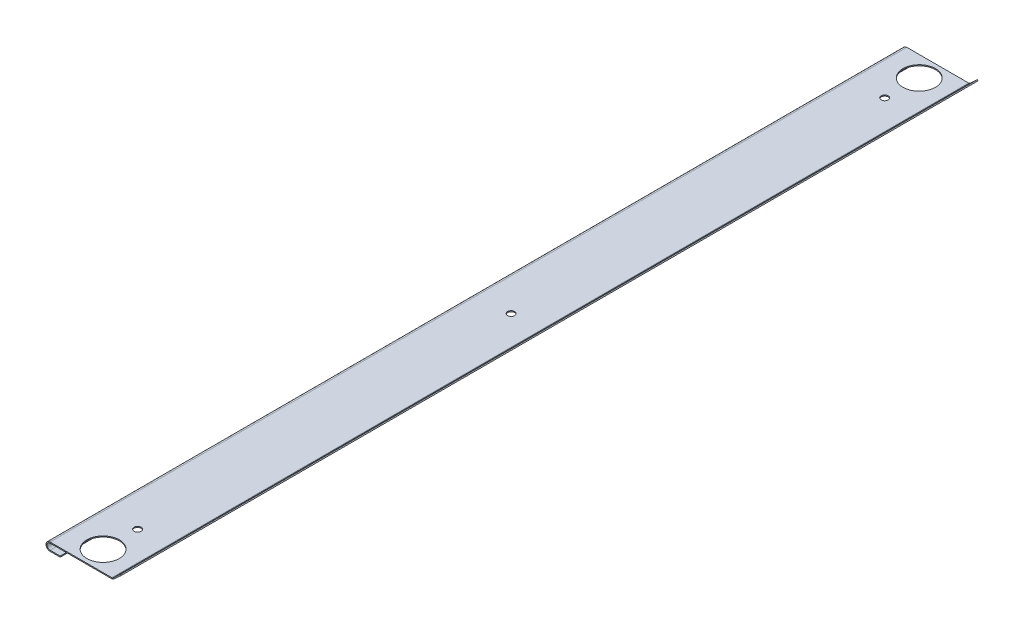
ISO-10303-21;
HEADER;
FILE_DESCRIPTION(('STEP AP214'),'2;1');
FILE_NAME('part.step','',(''),(''),'','','');
FILE_SCHEMA(('AUTOMOTIVE_DESIGN { 1 0 10303 214 1 1 1 1 }'));
ENDSEC;
DATA;
#1=APPLICATION_CONTEXT('core data for automotive mechanical design processes');
#2=APPLICATION_PROTOCOL_DEFINITION('international standard','automotive_design',2000,#1);
#3=PRODUCT_CONTEXT('',#1,'mechanical');
#4=PRODUCT('Part','Part','',(#3));
#5=PRODUCT_RELATED_PRODUCT_CATEGORY('part','',(#4));
#6=PRODUCT_DEFINITION_FORMATION('','',#4);
#7=PRODUCT_DEFINITION_CONTEXT('part definition',#1,'design');
#8=PRODUCT_DEFINITION('design','',#6,#7);
#9=PRODUCT_DEFINITION_SHAPE('','',#8);
#10=(LENGTH_UNIT() NAMED_UNIT(*) SI_UNIT(.MILLI.,.METRE.));
#11=(NAMED_UNIT(*) PLANE_ANGLE_UNIT() SI_UNIT($,.RADIAN.));
#12=(NAMED_UNIT(*) SI_UNIT($,.STERADIAN.) SOLID_ANGLE_UNIT());
#13=UNCERTAINTY_MEASURE_WITH_UNIT(LENGTH_MEASURE(1.E-05),#10,'distance_accuracy_value','');
#14=(GEOMETRIC_REPRESENTATION_CONTEXT(3) GLOBAL_UNCERTAINTY_ASSIGNED_CONTEXT((#13)) GLOBAL_UNIT_ASSIGNED_CONTEXT((#10,
#11,#12)) REPRESENTATION_CONTEXT('',''));
#15=CARTESIAN_POINT('',(0.,0.,0.));
#16=DIRECTION('',(0.,0.,1.));
#17=DIRECTION('',(1.,0.,0.));
#18=AXIS2_PLACEMENT_3D('',#15,#16,#17);
#19=CARTESIAN_POINT('',(0.,0.5,211.));
#20=DIRECTION('',(0.,1.,0.));
#21=DIRECTION('',(-1.,0.,0.));
#22=AXIS2_PLACEMENT_3D('',#19,#20,#21);
#23=PLANE('',#22);
#24=CARTESIAN_POINT('',(-14.8833180977794,0.499999999999998,184.));
#25=DIRECTION('',(0.,1.,0.));
#26=DIRECTION('',(1.,0.,0.));
#27=AXIS2_PLACEMENT_3D('',#24,#25,#26);
#28=CIRCLE('',#27,1.74999999999999);
#29=CARTESIAN_POINT('',(-13.1333180977794,0.499999999999998,184.));
#30=VERTEX_POINT('',#29);
#31=EDGE_CURVE('E607',#30,#30,#28,.T.);
#32=ORIENTED_EDGE('',*,*,#31,.F.);
#33=EDGE_LOOP('',(#32));
#34=FACE_BOUND('',#33,.T.);
#35=CARTESIAN_POINT('',(-14.8833180977795,0.499999999999998,-184.));
#36=DIRECTION('',(0.,1.,0.));
#37=DIRECTION('',(-1.,0.,0.));
#38=AXIS2_PLACEMENT_3D('',#35,#36,#37);
#39=CIRCLE('',#38,1.74999999999999);
#40=CARTESIAN_POINT('',(-16.6333180977795,0.499999999999998,-184.));
#41=VERTEX_POINT('',#40);
#42=EDGE_CURVE('E601',#41,#41,#39,.T.);
#43=ORIENTED_EDGE('',*,*,#42,.F.);
#44=EDGE_LOOP('',(#43));
#45=FACE_BOUND('',#44,.T.);
#46=CARTESIAN_POINT('',(-14.8833180977795,0.499999999999998,0.));
#47=DIRECTION('',(0.,1.,0.));
#48=DIRECTION('',(-1.,0.,0.));
#49=AXIS2_PLACEMENT_3D('',#46,#47,#48);
#50=CIRCLE('',#49,1.75);
#51=CARTESIAN_POINT('',(-16.6333180977795,0.499999999999998,0.));
#52=VERTEX_POINT('',#51);
#53=EDGE_CURVE('E595',#52,#52,#50,.T.);
#54=ORIENTED_EDGE('',*,*,#53,.F.);
#55=EDGE_LOOP('',(#54));
#56=FACE_BOUND('',#55,.T.);
#57=CARTESIAN_POINT('',(-14.8833180977795,0.499999999999998,-201.));
#58=DIRECTION('',(0.,1.,0.));
#59=DIRECTION('',(-1.,0.,0.));
#60=AXIS2_PLACEMENT_3D('',#57,#58,#59);
#61=CIRCLE('',#60,8.00000000000002);
#62=CARTESIAN_POINT('',(-22.8833180977795,0.499999999999997,-201.));
#63=VERTEX_POINT('',#62);
#64=EDGE_CURVE('E180',#63,#63,#61,.F.);
#65=ORIENTED_EDGE('',*,*,#64,.T.);
#66=EDGE_LOOP('',(#65));
#67=FACE_BOUND('',#66,.T.);
#68=DIRECTION('',(1.,0.,0.));
#69=VECTOR('',#68,1.);
#70=CARTESIAN_POINT('',(0.,0.5,-211.));
#71=LINE('',#70,#69);
#72=CARTESIAN_POINT('',(-31.,0.499999999999996,-211.));
#73=VERTEX_POINT('',#72);
#74=CARTESIAN_POINT('',(-0.58331809777948,0.5,-211.));
#75=VERTEX_POINT('',#74);
#76=EDGE_CURVE('E188',#73,#75,#71,.T.);
#77=ORIENTED_EDGE('',*,*,#76,.F.);
#78=DIRECTION('',(0.,0.,-1.));
#79=VECTOR('',#78,1.);
#80=CARTESIAN_POINT('',(-31.,0.499999999999996,211.));
#81=LINE('',#80,#79);
#82=CARTESIAN_POINT('',(-31.,0.499999999999996,211.));
#83=VERTEX_POINT('',#82);
#84=EDGE_CURVE('E218',#83,#73,#81,.T.);
#85=ORIENTED_EDGE('',*,*,#84,.F.);
#86=DIRECTION('',(1.,0.,0.));
#87=VECTOR('',#86,1.);
#88=CARTESIAN_POINT('',(0.,0.5,211.));
#89=LINE('',#88,#87);
#90=CARTESIAN_POINT('',(-0.58331809777948,0.5,211.));
#91=VERTEX_POINT('',#90);
#92=EDGE_CURVE('E142',#83,#91,#89,.T.);
#93=ORIENTED_EDGE('',*,*,#92,.T.);
#94=DIRECTION('',(0.,0.,-1.));
#95=VECTOR('',#94,1.);
#96=CARTESIAN_POINT('',(-0.58331809777948,0.5,211.));
#97=LINE('',#96,#95);
#98=EDGE_CURVE('E221',#91,#75,#97,.T.);
#99=ORIENTED_EDGE('',*,*,#98,.T.);
#100=EDGE_LOOP('',(#77,#85,#93,#99));
#101=FACE_BOUND('',#100,.T.);
#102=CARTESIAN_POINT('',(-14.8833180977794,0.499999999999998,201.));
#103=DIRECTION('',(0.,1.,0.));
#104=DIRECTION('',(-1.,0.,0.));
#105=AXIS2_PLACEMENT_3D('',#102,#103,#104);
#106=CIRCLE('',#105,8.00000000000002);
#107=CARTESIAN_POINT('',(-22.8833180977795,0.499999999999997,201.));
#108=VERTEX_POINT('',#107);
#109=EDGE_CURVE('E588',#108,#108,#106,.F.);
#110=ORIENTED_EDGE('',*,*,#109,.T.);
#111=EDGE_LOOP('',(#110));
#112=FACE_BOUND('',#111,.T.);
#113=ADVANCED_FACE('F38',(#34,#45,#56,#67,#101,#112),#23,.T.);
#114=CARTESIAN_POINT('',(0.,0.,211.));
#115=DIRECTION('',(0.,1.,0.));
#116=DIRECTION('',(-1.,0.,0.));
#117=AXIS2_PLACEMENT_3D('',#114,#115,#116);
#118=PLANE('',#117);
#119=CARTESIAN_POINT('',(-14.8833180977794,0.,184.));
#120=DIRECTION('',(0.,1.,0.));
#121=DIRECTION('',(1.,0.,0.));
#122=AXIS2_PLACEMENT_3D('',#119,#120,#121);
#123=CIRCLE('',#122,1.74999999999999);
#124=CARTESIAN_POINT('',(-13.1333180977794,0.,184.));
#125=VERTEX_POINT('',#124);
#126=EDGE_CURVE('E604',#125,#125,#123,.T.);
#127=ORIENTED_EDGE('',*,*,#126,.T.);
#128=EDGE_LOOP('',(#127));
#129=FACE_BOUND('',#128,.T.);
#130=CARTESIAN_POINT('',(-14.8833180977795,0.,-184.));
#131=DIRECTION('',(0.,1.,0.));
#132=DIRECTION('',(-1.,0.,0.));
#133=AXIS2_PLACEMENT_3D('',#130,#131,#132);
#134=CIRCLE('',#133,1.74999999999999);
#135=CARTESIAN_POINT('',(-16.6333180977795,0.,-184.));
#136=VERTEX_POINT('',#135);
#137=EDGE_CURVE('E598',#136,#136,#134,.T.);
#138=ORIENTED_EDGE('',*,*,#137,.T.);
#139=EDGE_LOOP('',(#138));
#140=FACE_BOUND('',#139,.T.);
#141=CARTESIAN_POINT('',(-14.8833180977795,0.,0.));
#142=DIRECTION('',(0.,1.,0.));
#143=DIRECTION('',(-1.,0.,0.));
#144=AXIS2_PLACEMENT_3D('',#141,#142,#143);
#145=CIRCLE('',#144,1.75);
#146=CARTESIAN_POINT('',(-16.6333180977795,0.,0.));
#147=VERTEX_POINT('',#146);
#148=EDGE_CURVE('E594',#147,#147,#145,.T.);
#149=ORIENTED_EDGE('',*,*,#148,.T.);
#150=EDGE_LOOP('',(#149));
#151=FACE_BOUND('',#150,.T.);
#152=DIRECTION('',(1.,0.,0.));
#153=VECTOR('',#152,1.);
#154=CARTESIAN_POINT('',(0.,0.,-211.));
#155=LINE('',#154,#153);
#156=CARTESIAN_POINT('',(-31.,0.,-211.));
#157=VERTEX_POINT('',#156);
#158=CARTESIAN_POINT('',(-0.58331809777948,0.,-211.));
#159=VERTEX_POINT('',#158);
#160=EDGE_CURVE('E203',#157,#159,#155,.T.);
#161=ORIENTED_EDGE('',*,*,#160,.T.);
#162=DIRECTION('',(0.,0.,-1.));
#163=VECTOR('',#162,1.);
#164=CARTESIAN_POINT('',(-0.58331809777948,0.,211.));
#165=LINE('',#164,#163);
#166=CARTESIAN_POINT('',(-0.58331809777948,0.,211.));
#167=VERTEX_POINT('',#166);
#168=EDGE_CURVE('E164',#167,#159,#165,.T.);
#169=ORIENTED_EDGE('',*,*,#168,.F.);
#170=DIRECTION('',(1.,0.,0.));
#171=VECTOR('',#170,1.);
#172=CARTESIAN_POINT('',(0.,0.,211.));
#173=LINE('',#172,#171);
#174=CARTESIAN_POINT('',(-31.,0.,211.));
#175=VERTEX_POINT('',#174);
#176=EDGE_CURVE('E139',#175,#167,#173,.T.);
#177=ORIENTED_EDGE('',*,*,#176,.F.);
#178=DIRECTION('',(0.,0.,-1.));
#179=VECTOR('',#178,1.);
#180=CARTESIAN_POINT('',(-31.,0.,211.));
#181=LINE('',#180,#179);
#182=EDGE_CURVE('E158',#175,#157,#181,.T.);
#183=ORIENTED_EDGE('',*,*,#182,.T.);
#184=EDGE_LOOP('',(#161,#169,#177,#183));
#185=FACE_BOUND('',#184,.T.);
#186=CARTESIAN_POINT('',(-14.8833180977795,0.,-201.));
#187=DIRECTION('',(0.,1.,0.));
#188=DIRECTION('',(0.,0.,1.));
#189=AXIS2_PLACEMENT_3D('',#186,#187,#188);
#190=CIRCLE('',#189,8.00000000000002);
#191=CARTESIAN_POINT('',(-14.8833180977795,0.,-193.));
#192=VERTEX_POINT('',#191);
#193=EDGE_CURVE('E585',#192,#192,#190,.T.);
#194=ORIENTED_EDGE('',*,*,#193,.T.);
#195=EDGE_LOOP('',(#194));
#196=FACE_BOUND('',#195,.T.);
#197=CARTESIAN_POINT('',(-14.8833180977794,0.,201.));
#198=DIRECTION('',(0.,1.,0.));
#199=DIRECTION('',(0.,0.,-1.));
#200=AXIS2_PLACEMENT_3D('',#197,#198,#199);
#201=CIRCLE('',#200,8.00000000000002);
#202=CARTESIAN_POINT('',(-14.8833180977794,0.,193.));
#203=VERTEX_POINT('',#202);
#204=EDGE_CURVE('E591',#203,#203,#201,.T.);
#205=ORIENTED_EDGE('',*,*,#204,.T.);
#206=EDGE_LOOP('',(#205));
#207=FACE_BOUND('',#206,.T.);
#208=ADVANCED_FACE('F166',(#129,#140,#151,#185,#196,#207),#118,.F.);
#209=CARTESIAN_POINT('',(-31.,-3.,211.));
#210=DIRECTION('',(0.,0.,1.));
#211=DIRECTION('',(1.,0.,0.));
#212=AXIS2_PLACEMENT_3D('',#209,#210,#211);
#213=PLANE('',#212);
#214=DIRECTION('',(0.,-1.,0.));
#215=VECTOR('',#214,1.);
#216=CARTESIAN_POINT('',(-31.,-3.,211.));
#217=LINE('',#216,#215);
#218=CARTESIAN_POINT('',(-31.,-3.,211.));
#219=VERTEX_POINT('',#218);
#220=CARTESIAN_POINT('',(-31.,-3.5,211.));
#221=VERTEX_POINT('',#220);
#222=EDGE_CURVE('E11',#219,#221,#217,.T.);
#223=ORIENTED_EDGE('',*,*,#222,.F.);
#224=CARTESIAN_POINT('',(-31.,-1.5,211.));
#225=DIRECTION('',(0.,0.,-1.));
#226=DIRECTION('',(1.,0.,0.));
#227=AXIS2_PLACEMENT_3D('',#224,#225,#226);
#228=CIRCLE('',#227,1.5);
#229=EDGE_CURVE('E149',#219,#175,#228,.T.);
#230=ORIENTED_EDGE('',*,*,#229,.T.);
#231=DIRECTION('',(0.,-1.,0.));
#232=VECTOR('',#231,1.);
#233=CARTESIAN_POINT('',(-31.,0.499999999999996,211.));
#234=LINE('',#233,#232);
#235=EDGE_CURVE('E47',#83,#175,#234,.T.);
#236=ORIENTED_EDGE('',*,*,#235,.F.);
#237=CARTESIAN_POINT('',(-31.,-1.5,211.));
#238=DIRECTION('',(0.,0.,1.));
#239=DIRECTION('',(1.,0.,0.));
#240=AXIS2_PLACEMENT_3D('',#237,#238,#239);
#241=CIRCLE('',#240,2.);
#242=EDGE_CURVE('E245',#221,#83,#241,.F.);
#243=ORIENTED_EDGE('',*,*,#242,.F.);
#244=EDGE_LOOP('',(#223,#230,#236,#243));
#245=FACE_BOUND('',#244,.T.);
#246=ADVANCED_FACE('F40',(#245),#213,.T.);
#247=CARTESIAN_POINT('',(-31.,0.499999999999996,211.));
#248=DIRECTION('',(0.,0.,1.));
#249=DIRECTION('',(1.,0.,0.));
#250=AXIS2_PLACEMENT_3D('',#247,#248,#249);
#251=PLANE('',#250);
#252=DIRECTION('',(-1.,0.,0.));
#253=VECTOR('',#252,1.);
#254=CARTESIAN_POINT('',(-31.,-3.,211.));
#255=LINE('',#254,#253);
#256=CARTESIAN_POINT('',(-26.,-3.,211.));
#257=VERTEX_POINT('',#256);
#258=EDGE_CURVE('E154',#257,#219,#255,.T.);
#259=ORIENTED_EDGE('',*,*,#258,.T.);
#260=ORIENTED_EDGE('',*,*,#222,.T.);
#261=DIRECTION('',(1.,0.,0.));
#262=VECTOR('',#261,1.);
#263=CARTESIAN_POINT('',(-31.,-3.5,211.));
#264=LINE('',#263,#262);
#265=CARTESIAN_POINT('',(-26.,-3.5,211.));
#266=VERTEX_POINT('',#265);
#267=EDGE_CURVE('E258',#266,#221,#264,.F.);
#268=ORIENTED_EDGE('',*,*,#267,.F.);
#269=DIRECTION('',(0.,-1.,0.));
#270=VECTOR('',#269,1.);
#271=CARTESIAN_POINT('',(-26.,-3.,211.));
#272=LINE('',#271,#270);
#273=EDGE_CURVE('E260',#257,#266,#272,.T.);
#274=ORIENTED_EDGE('',*,*,#273,.F.);
#275=EDGE_LOOP('',(#259,#260,#268,#274));
#276=FACE_BOUND('',#275,.T.);
#277=ADVANCED_FACE('F271',(#276),#251,.T.);
#278=CARTESIAN_POINT('',(-31.,0.,-211.));
#279=DIRECTION('',(0.,0.,-1.));
#280=DIRECTION('',(-1.,0.,0.));
#281=AXIS2_PLACEMENT_3D('',#278,#279,#280);
#282=PLANE('',#281);
#283=DIRECTION('',(0.,1.,0.));
#284=VECTOR('',#283,1.);
#285=CARTESIAN_POINT('',(-31.,0.,-211.));
#286=LINE('',#285,#284);
#287=EDGE_CURVE('E147',#157,#73,#286,.T.);
#288=ORIENTED_EDGE('',*,*,#287,.F.);
#289=CARTESIAN_POINT('',(-31.,-1.5,-211.));
#290=DIRECTION('',(0.,0.,-1.));
#291=DIRECTION('',(1.,0.,0.));
#292=AXIS2_PLACEMENT_3D('',#289,#290,#291);
#293=CIRCLE('',#292,1.5);
#294=CARTESIAN_POINT('',(-31.,-3.,-211.));
#295=VERTEX_POINT('',#294);
#296=EDGE_CURVE('E161',#295,#157,#293,.T.);
#297=ORIENTED_EDGE('',*,*,#296,.F.);
#298=DIRECTION('',(0.,1.,0.));
#299=VECTOR('',#298,1.);
#300=CARTESIAN_POINT('',(-31.,-3.5,-211.));
#301=LINE('',#300,#299);
#302=CARTESIAN_POINT('',(-31.,-3.5,-211.));
#303=VERTEX_POINT('',#302);
#304=EDGE_CURVE('E236',#303,#295,#301,.T.);
#305=ORIENTED_EDGE('',*,*,#304,.F.);
#306=CARTESIAN_POINT('',(-31.,-1.5,-211.));
#307=DIRECTION('',(0.,0.,1.));
#308=DIRECTION('',(1.,0.,0.));
#309=AXIS2_PLACEMENT_3D('',#306,#307,#308);
#310=CIRCLE('',#309,2.);
#311=EDGE_CURVE('E190',#303,#73,#310,.F.);
#312=ORIENTED_EDGE('',*,*,#311,.T.);
#313=EDGE_LOOP('',(#288,#297,#305,#312));
#314=FACE_BOUND('',#313,.T.);
#315=ADVANCED_FACE('F250',(#314),#282,.T.);
#316=CARTESIAN_POINT('',(-31.,-3.5,-211.));
#317=DIRECTION('',(0.,0.,-1.));
#318=DIRECTION('',(-1.,0.,0.));
#319=AXIS2_PLACEMENT_3D('',#316,#317,#318);
#320=PLANE('',#319);
#321=ORIENTED_EDGE('',*,*,#160,.F.);
#322=ORIENTED_EDGE('',*,*,#287,.T.);
#323=ORIENTED_EDGE('',*,*,#76,.T.);
#324=DIRECTION('',(0.,-1.,0.));
#325=VECTOR('',#324,1.);
#326=CARTESIAN_POINT('',(-0.58331809777948,0.5,-211.));
#327=LINE('',#326,#325);
#328=EDGE_CURVE('E96',#75,#159,#327,.T.);
#329=ORIENTED_EDGE('',*,*,#328,.T.);
#330=EDGE_LOOP('',(#321,#322,#323,#329));
#331=FACE_BOUND('',#330,.T.);
#332=ADVANCED_FACE('F238',(#331),#320,.T.);
#333=CARTESIAN_POINT('',(-0.58331809777948,0.,211.));
#334=DIRECTION('',(0.,0.,1.));
#335=DIRECTION('',(1.,0.,0.));
#336=AXIS2_PLACEMENT_3D('',#333,#334,#335);
#337=PLANE('',#336);
#338=DIRECTION('',(0.,1.,0.));
#339=VECTOR('',#338,1.);
#340=CARTESIAN_POINT('',(-0.58331809777948,0.,211.));
#341=LINE('',#340,#339);
#342=EDGE_CURVE('E234',#167,#91,#341,.T.);
#343=ORIENTED_EDGE('',*,*,#342,.F.);
#344=CARTESIAN_POINT('',(-0.58331809777948,1.5,211.));
#345=DIRECTION('',(0.,0.,1.));
#346=DIRECTION('',(1.,0.,0.));
#347=AXIS2_PLACEMENT_3D('',#344,#345,#346);
#348=CIRCLE('',#347,1.5);
#349=CARTESIAN_POINT('',(0.430067213644005,0.39408399478481,211.));
#350=VERTEX_POINT('',#349);
#351=EDGE_CURVE('E170',#167,#350,#348,.T.);
#352=ORIENTED_EDGE('',*,*,#351,.T.);
#353=DIRECTION('',(0.675590207615656,-0.737277336810128,0.));
#354=VECTOR('',#353,1.);
#355=CARTESIAN_POINT('',(0.0922721098361771,0.762722663189873,211.));
#356=LINE('',#355,#354);
#357=CARTESIAN_POINT('',(0.0922721098361771,0.762722663189873,211.));
#358=VERTEX_POINT('',#357);
#359=EDGE_CURVE('E55',#358,#350,#356,.T.);
#360=ORIENTED_EDGE('',*,*,#359,.F.);
#361=CARTESIAN_POINT('',(-0.58331809777948,1.5,211.));
#362=DIRECTION('',(0.,0.,1.));
#363=DIRECTION('',(1.,0.,0.));
#364=AXIS2_PLACEMENT_3D('',#361,#362,#363);
#365=CIRCLE('',#364,1.);
#366=EDGE_CURVE('E262',#91,#358,#365,.T.);
#367=ORIENTED_EDGE('',*,*,#366,.F.);
#368=EDGE_LOOP('',(#343,#352,#360,#367));
#369=FACE_BOUND('',#368,.T.);
#370=ADVANCED_FACE('F323',(#369),#337,.T.);
#371=CARTESIAN_POINT('',(0.0922721098361771,0.762722663189873,211.));
#372=DIRECTION('',(0.,0.,1.));
#373=DIRECTION('',(1.,0.,0.));
#374=AXIS2_PLACEMENT_3D('',#371,#372,#373);
#375=PLANE('',#374);
#376=ORIENTED_EDGE('',*,*,#176,.T.);
#377=ORIENTED_EDGE('',*,*,#342,.T.);
#378=ORIENTED_EDGE('',*,*,#92,.F.);
#379=ORIENTED_EDGE('',*,*,#235,.T.);
#380=EDGE_LOOP('',(#376,#377,#378,#379));
#381=FACE_BOUND('',#380,.T.);
#382=ADVANCED_FACE('F137',(#381),#375,.T.);
#383=CARTESIAN_POINT('',(0.430067213644005,0.39408399478481,-211.));
#384=DIRECTION('',(0.,0.,-1.));
#385=DIRECTION('',(-1.,0.,0.));
#386=AXIS2_PLACEMENT_3D('',#383,#384,#385);
#387=PLANE('',#386);
#388=DIRECTION('',(-0.675590207615656,0.737277336810128,0.));
#389=VECTOR('',#388,1.);
#390=CARTESIAN_POINT('',(0.430067213644005,0.39408399478481,-211.));
#391=LINE('',#390,#389);
#392=CARTESIAN_POINT('',(0.430067213644005,0.39408399478481,-211.));
#393=VERTEX_POINT('',#392);
#394=CARTESIAN_POINT('',(0.0922721098361771,0.762722663189873,-211.));
#395=VERTEX_POINT('',#394);
#396=EDGE_CURVE('E103',#393,#395,#391,.T.);
#397=ORIENTED_EDGE('',*,*,#396,.F.);
#398=CARTESIAN_POINT('',(-0.58331809777948,1.5,-211.));
#399=DIRECTION('',(0.,0.,1.));
#400=DIRECTION('',(1.,0.,0.));
#401=AXIS2_PLACEMENT_3D('',#398,#399,#400);
#402=CIRCLE('',#401,1.5);
#403=EDGE_CURVE('E205',#159,#393,#402,.T.);
#404=ORIENTED_EDGE('',*,*,#403,.F.);
#405=ORIENTED_EDGE('',*,*,#328,.F.);
#406=CARTESIAN_POINT('',(-0.58331809777948,1.5,-211.));
#407=DIRECTION('',(0.,0.,1.));
#408=DIRECTION('',(1.,0.,0.));
#409=AXIS2_PLACEMENT_3D('',#406,#407,#408);
#410=CIRCLE('',#409,1.);
#411=EDGE_CURVE('E186',#75,#395,#410,.T.);
#412=ORIENTED_EDGE('',*,*,#411,.T.);
#413=EDGE_LOOP('',(#397,#404,#405,#412));
#414=FACE_BOUND('',#413,.T.);
#415=ADVANCED_FACE('F317',(#414),#387,.T.);
#416=CARTESIAN_POINT('',(-0.58331809777948,0.5,-211.));
#417=DIRECTION('',(0.,0.,-1.));
#418=DIRECTION('',(-1.,0.,0.));
#419=AXIS2_PLACEMENT_3D('',#416,#417,#418);
#420=PLANE('',#419);
#421=DIRECTION('',(0.737277336810127,0.675590207615657,0.));
#422=VECTOR('',#421,1.);
#423=CARTESIAN_POINT('',(0.,0.,-211.));
#424=LINE('',#423,#422);
#425=CARTESIAN_POINT('',(4.0550253524557,3.71574614188611,-211.));
#426=VERTEX_POINT('',#425);
#427=EDGE_CURVE('E176',#393,#426,#424,.T.);
#428=ORIENTED_EDGE('',*,*,#427,.F.);
#429=ORIENTED_EDGE('',*,*,#396,.T.);
#430=DIRECTION('',(0.737277336810128,0.675590207615657,0.));
#431=VECTOR('',#430,1.);
#432=CARTESIAN_POINT('',(-0.337795103807828,0.368638668405064,-211.));
#433=LINE('',#432,#431);
#434=CARTESIAN_POINT('',(3.71723024864787,4.08438481029118,-211.));
#435=VERTEX_POINT('',#434);
#436=EDGE_CURVE('E183',#395,#435,#433,.T.);
#437=ORIENTED_EDGE('',*,*,#436,.T.);
#438=DIRECTION('',(0.675590207615654,-0.73727733681013,0.));
#439=VECTOR('',#438,1.);
#440=CARTESIAN_POINT('',(3.71723024864787,4.08438481029118,-211.));
#441=LINE('',#440,#439);
#442=EDGE_CURVE('E179',#435,#426,#441,.T.);
#443=ORIENTED_EDGE('',*,*,#442,.T.);
#444=EDGE_LOOP('',(#428,#429,#437,#443));
#445=FACE_BOUND('',#444,.T.);
#446=ADVANCED_FACE('F313',(#445),#420,.T.);
#447=CARTESIAN_POINT('',(0.,0.,211.));
#448=DIRECTION('',(-0.675590207615656,0.737277336810127,0.));
#449=DIRECTION('',(-0.737277336810127,-0.675590207615657,0.));
#450=AXIS2_PLACEMENT_3D('',#447,#448,#449);
#451=PLANE('',#450);
#452=ORIENTED_EDGE('',*,*,#427,.T.);
#453=DIRECTION('',(0.,0.,-1.));
#454=VECTOR('',#453,1.);
#455=CARTESIAN_POINT('',(4.0550253524557,3.71574614188611,211.));
#456=LINE('',#455,#454);
#457=CARTESIAN_POINT('',(4.0550253524557,3.71574614188611,211.));
#458=VERTEX_POINT('',#457);
#459=EDGE_CURVE('E229',#458,#426,#456,.T.);
#460=ORIENTED_EDGE('',*,*,#459,.F.);
#461=DIRECTION('',(0.737277336810127,0.675590207615657,0.));
#462=VECTOR('',#461,1.);
#463=CARTESIAN_POINT('',(0.,0.,211.));
#464=LINE('',#463,#462);
#465=EDGE_CURVE('E109',#350,#458,#464,.T.);
#466=ORIENTED_EDGE('',*,*,#465,.F.);
#467=DIRECTION('',(0.,0.,-1.));
#468=VECTOR('',#467,1.);
#469=CARTESIAN_POINT('',(0.430067213644005,0.39408399478481,211.));
#470=LINE('',#469,#468);
#471=EDGE_CURVE('E172',#350,#393,#470,.T.);
#472=ORIENTED_EDGE('',*,*,#471,.T.);
#473=EDGE_LOOP('',(#452,#460,#466,#472));
#474=FACE_BOUND('',#473,.T.);
#475=ADVANCED_FACE('F309',(#474),#451,.F.);
#476=CARTESIAN_POINT('',(3.71723024864787,4.08438481029118,211.));
#477=DIRECTION('',(0.73727733681013,0.675590207615653,0.));
#478=DIRECTION('',(-0.675590207615653,0.73727733681013,0.));
#479=AXIS2_PLACEMENT_3D('',#476,#477,#478);
#480=PLANE('',#479);
#481=ORIENTED_EDGE('',*,*,#442,.F.);
#482=DIRECTION('',(0.,0.,-1.));
#483=VECTOR('',#482,1.);
#484=CARTESIAN_POINT('',(3.71723024864787,4.08438481029118,211.));
#485=LINE('',#484,#483);
#486=CARTESIAN_POINT('',(3.71723024864787,4.08438481029118,211.));
#487=VERTEX_POINT('',#486);
#488=EDGE_CURVE('E227',#487,#435,#485,.T.);
#489=ORIENTED_EDGE('',*,*,#488,.F.);
#490=DIRECTION('',(0.675590207615654,-0.73727733681013,0.));
#491=VECTOR('',#490,1.);
#492=CARTESIAN_POINT('',(3.71723024864787,4.08438481029118,211.));
#493=LINE('',#492,#491);
#494=EDGE_CURVE('E573',#487,#458,#493,.T.);
#495=ORIENTED_EDGE('',*,*,#494,.T.);
#496=ORIENTED_EDGE('',*,*,#459,.T.);
#497=EDGE_LOOP('',(#481,#489,#495,#496));
#498=FACE_BOUND('',#497,.T.);
#499=ADVANCED_FACE('F305',(#498),#480,.T.);
#500=CARTESIAN_POINT('',(-0.337795103807828,0.368638668405064,211.));
#501=DIRECTION('',(-0.675590207615656,0.737277336810127,0.));
#502=DIRECTION('',(-0.737277336810128,-0.675590207615657,0.));
#503=AXIS2_PLACEMENT_3D('',#500,#501,#502);
#504=PLANE('',#503);
#505=ORIENTED_EDGE('',*,*,#436,.F.);
#506=DIRECTION('',(0.,0.,-1.));
#507=VECTOR('',#506,1.);
#508=CARTESIAN_POINT('',(0.0922721098361771,0.762722663189873,211.));
#509=LINE('',#508,#507);
#510=EDGE_CURVE('E224',#358,#395,#509,.T.);
#511=ORIENTED_EDGE('',*,*,#510,.F.);
#512=DIRECTION('',(0.737277336810128,0.675590207615657,0.));
#513=VECTOR('',#512,1.);
#514=CARTESIAN_POINT('',(-0.337795103807828,0.368638668405064,211.));
#515=LINE('',#514,#513);
#516=EDGE_CURVE('E575',#358,#487,#515,.T.);
#517=ORIENTED_EDGE('',*,*,#516,.T.);
#518=ORIENTED_EDGE('',*,*,#488,.T.);
#519=EDGE_LOOP('',(#505,#511,#517,#518));
#520=FACE_BOUND('',#519,.T.);
#521=ADVANCED_FACE('F301',(#520),#504,.T.);
#522=CARTESIAN_POINT('',(-0.58331809777948,1.5,211.));
#523=DIRECTION('',(0.,0.,-1.));
#524=DIRECTION('',(-1.,0.,0.));
#525=AXIS2_PLACEMENT_3D('',#522,#523,#524);
#526=CYLINDRICAL_SURFACE('',#525,1.);
#527=ORIENTED_EDGE('',*,*,#411,.F.);
#528=ORIENTED_EDGE('',*,*,#98,.F.);
#529=ORIENTED_EDGE('',*,*,#366,.T.);
#530=ORIENTED_EDGE('',*,*,#510,.T.);
#531=EDGE_LOOP('',(#527,#528,#529,#530));
#532=FACE_BOUND('',#531,.T.);
#533=ADVANCED_FACE('F298',(#532),#526,.F.);
#534=CARTESIAN_POINT('',(-31.,-1.5,211.));
#535=DIRECTION('',(0.,0.,-1.));
#536=DIRECTION('',(-1.,0.,0.));
#537=AXIS2_PLACEMENT_3D('',#534,#535,#536);
#538=CYLINDRICAL_SURFACE('',#537,2.);
#539=ORIENTED_EDGE('',*,*,#311,.F.);
#540=DIRECTION('',(0.,0.,-1.));
#541=VECTOR('',#540,1.);
#542=CARTESIAN_POINT('',(-31.,-3.5,211.));
#543=LINE('',#542,#541);
#544=EDGE_CURVE('E215',#221,#303,#543,.T.);
#545=ORIENTED_EDGE('',*,*,#544,.F.);
#546=ORIENTED_EDGE('',*,*,#242,.T.);
#547=ORIENTED_EDGE('',*,*,#84,.T.);
#548=EDGE_LOOP('',(#539,#545,#546,#547));
#549=FACE_BOUND('',#548,.T.);
#550=ADVANCED_FACE('F243',(#549),#538,.T.);
#551=CARTESIAN_POINT('',(-31.,-3.5,211.));
#552=DIRECTION('',(0.,-1.,0.));
#553=DIRECTION('',(0.,0.,-1.));
#554=AXIS2_PLACEMENT_3D('',#551,#552,#553);
#555=PLANE('',#554);
#556=DIRECTION('',(1.,0.,0.));
#557=VECTOR('',#556,1.);
#558=CARTESIAN_POINT('',(-31.,-3.5,-211.));
#559=LINE('',#558,#557);
#560=CARTESIAN_POINT('',(-26.,-3.5,-211.));
#561=VERTEX_POINT('',#560);
#562=EDGE_CURVE('E193',#561,#303,#559,.F.);
#563=ORIENTED_EDGE('',*,*,#562,.F.);
#564=DIRECTION('',(0.,0.,-1.));
#565=VECTOR('',#564,1.);
#566=CARTESIAN_POINT('',(-26.,-3.5,211.));
#567=LINE('',#566,#565);
#568=EDGE_CURVE('E213',#266,#561,#567,.T.);
#569=ORIENTED_EDGE('',*,*,#568,.F.);
#570=ORIENTED_EDGE('',*,*,#267,.T.);
#571=ORIENTED_EDGE('',*,*,#544,.T.);
#572=EDGE_LOOP('',(#563,#569,#570,#571));
#573=FACE_BOUND('',#572,.T.);
#574=ADVANCED_FACE('F256',(#573),#555,.T.);
#575=CARTESIAN_POINT('',(-26.,-3.,211.));
#576=DIRECTION('',(1.,0.,0.));
#577=DIRECTION('',(0.,0.,-1.));
#578=AXIS2_PLACEMENT_3D('',#575,#576,#577);
#579=PLANE('',#578);
#580=DIRECTION('',(0.,-1.,0.));
#581=VECTOR('',#580,1.);
#582=CARTESIAN_POINT('',(-26.,-3.,-211.));
#583=LINE('',#582,#581);
#584=CARTESIAN_POINT('',(-26.,-3.,-211.));
#585=VERTEX_POINT('',#584);
#586=EDGE_CURVE('E196',#585,#561,#583,.T.);
#587=ORIENTED_EDGE('',*,*,#586,.F.);
#588=DIRECTION('',(0.,0.,-1.));
#589=VECTOR('',#588,1.);
#590=CARTESIAN_POINT('',(-26.,-3.,211.));
#591=LINE('',#590,#589);
#592=EDGE_CURVE('E211',#257,#585,#591,.T.);
#593=ORIENTED_EDGE('',*,*,#592,.F.);
#594=ORIENTED_EDGE('',*,*,#273,.T.);
#595=ORIENTED_EDGE('',*,*,#568,.T.);
#596=EDGE_LOOP('',(#587,#593,#594,#595));
#597=FACE_BOUND('',#596,.T.);
#598=ADVANCED_FACE('F277',(#597),#579,.T.);
#599=CARTESIAN_POINT('',(-31.,-3.,211.));
#600=DIRECTION('',(0.,-1.,0.));
#601=DIRECTION('',(0.,0.,-1.));
#602=AXIS2_PLACEMENT_3D('',#599,#600,#601);
#603=PLANE('',#602);
#604=DIRECTION('',(-1.,0.,0.));
#605=VECTOR('',#604,1.);
#606=CARTESIAN_POINT('',(-31.,-3.,-211.));
#607=LINE('',#606,#605);
#608=EDGE_CURVE('E199',#585,#295,#607,.T.);
#609=ORIENTED_EDGE('',*,*,#608,.T.);
#610=DIRECTION('',(0.,0.,-1.));
#611=VECTOR('',#610,1.);
#612=CARTESIAN_POINT('',(-31.,-3.,211.));
#613=LINE('',#612,#611);
#614=EDGE_CURVE('E163',#219,#295,#613,.T.);
#615=ORIENTED_EDGE('',*,*,#614,.F.);
#616=ORIENTED_EDGE('',*,*,#258,.F.);
#617=ORIENTED_EDGE('',*,*,#592,.T.);
#618=EDGE_LOOP('',(#609,#615,#616,#617));
#619=FACE_BOUND('',#618,.T.);
#620=ADVANCED_FACE('F273',(#619),#603,.F.);
#621=CARTESIAN_POINT('',(-31.,-1.5,211.));
#622=DIRECTION('',(0.,0.,-1.));
#623=DIRECTION('',(-1.,0.,0.));
#624=AXIS2_PLACEMENT_3D('',#621,#622,#623);
#625=CYLINDRICAL_SURFACE('',#624,1.5);
#626=ORIENTED_EDGE('',*,*,#296,.T.);
#627=ORIENTED_EDGE('',*,*,#182,.F.);
#628=ORIENTED_EDGE('',*,*,#229,.F.);
#629=ORIENTED_EDGE('',*,*,#614,.T.);
#630=EDGE_LOOP('',(#626,#627,#628,#629));
#631=FACE_BOUND('',#630,.T.);
#632=ADVANCED_FACE('F159',(#631),#625,.F.);
#633=CARTESIAN_POINT('',(-0.58331809777948,1.5,211.));
#634=DIRECTION('',(0.,0.,-1.));
#635=DIRECTION('',(-1.,0.,0.));
#636=AXIS2_PLACEMENT_3D('',#633,#634,#635);
#637=CYLINDRICAL_SURFACE('',#636,1.5);
#638=ORIENTED_EDGE('',*,*,#403,.T.);
#639=ORIENTED_EDGE('',*,*,#471,.F.);
#640=ORIENTED_EDGE('',*,*,#351,.F.);
#641=ORIENTED_EDGE('',*,*,#168,.T.);
#642=EDGE_LOOP('',(#638,#639,#640,#641));
#643=FACE_BOUND('',#642,.T.);
#644=ADVANCED_FACE('F388',(#643),#637,.T.);
#645=CARTESIAN_POINT('',(-0.58331809777948,1.5,211.));
#646=DIRECTION('',(0.,0.,1.));
#647=DIRECTION('',(1.,0.,0.));
#648=AXIS2_PLACEMENT_3D('',#645,#646,#647);
#649=PLANE('',#648);
#650=ORIENTED_EDGE('',*,*,#465,.T.);
#651=ORIENTED_EDGE('',*,*,#494,.F.);
#652=ORIENTED_EDGE('',*,*,#516,.F.);
#653=ORIENTED_EDGE('',*,*,#359,.T.);
#654=EDGE_LOOP('',(#650,#651,#652,#653));
#655=FACE_BOUND('',#654,.T.);
#656=ADVANCED_FACE('F385',(#655),#649,.T.);
#657=CARTESIAN_POINT('',(-0.58331809777948,1.5,-211.));
#658=DIRECTION('',(0.,0.,1.));
#659=DIRECTION('',(1.,0.,0.));
#660=AXIS2_PLACEMENT_3D('',#657,#658,#659);
#661=PLANE('',#660);
#662=ORIENTED_EDGE('',*,*,#562,.T.);
#663=ORIENTED_EDGE('',*,*,#304,.T.);
#664=ORIENTED_EDGE('',*,*,#608,.F.);
#665=ORIENTED_EDGE('',*,*,#586,.T.);
#666=EDGE_LOOP('',(#662,#663,#664,#665));
#667=FACE_BOUND('',#666,.T.);
#668=ADVANCED_FACE('F275',(#667),#661,.F.);
#669=CARTESIAN_POINT('',(-14.8833180977795,4.08438481029118,-201.));
#670=DIRECTION('',(0.,-1.,0.));
#671=DIRECTION('',(0.,0.,-1.));
#672=AXIS2_PLACEMENT_3D('',#669,#670,#671);
#673=CYLINDRICAL_SURFACE('',#672,8.00000000000002);
#674=ORIENTED_EDGE('',*,*,#64,.F.);
#675=EDGE_LOOP('',(#674));
#676=FACE_BOUND('',#675,.T.);
#677=ORIENTED_EDGE('',*,*,#193,.F.);
#678=EDGE_LOOP('',(#677));
#679=FACE_BOUND('',#678,.T.);
#680=ADVANCED_FACE('F380',(#676,#679),#673,.F.);
#681=CARTESIAN_POINT('',(-14.8833180977794,4.08438481029118,201.));
#682=DIRECTION('',(0.,-1.,0.));
#683=DIRECTION('',(0.,0.,-1.));
#684=AXIS2_PLACEMENT_3D('',#681,#682,#683);
#685=CYLINDRICAL_SURFACE('',#684,8.00000000000002);
#686=ORIENTED_EDGE('',*,*,#109,.F.);
#687=EDGE_LOOP('',(#686));
#688=FACE_BOUND('',#687,.T.);
#689=ORIENTED_EDGE('',*,*,#204,.F.);
#690=EDGE_LOOP('',(#689));
#691=FACE_BOUND('',#690,.T.);
#692=ADVANCED_FACE('F376',(#688,#691),#685,.F.);
#693=CARTESIAN_POINT('',(-14.8833180977795,0.,0.));
#694=DIRECTION('',(0.,1.,0.));
#695=DIRECTION('',(-1.,0.,0.));
#696=AXIS2_PLACEMENT_3D('',#693,#694,#695);
#697=CYLINDRICAL_SURFACE('',#696,1.75);
#698=ORIENTED_EDGE('',*,*,#148,.F.);
#699=EDGE_LOOP('',(#698));
#700=FACE_BOUND('',#699,.T.);
#701=ORIENTED_EDGE('',*,*,#53,.T.);
#702=EDGE_LOOP('',(#701));
#703=FACE_BOUND('',#702,.T.);
#704=ADVANCED_FACE('F356',(#700,#703),#697,.F.);
#705=CARTESIAN_POINT('',(-14.8833180977795,0.,-184.));
#706=DIRECTION('',(0.,1.,0.));
#707=DIRECTION('',(-1.,0.,0.));
#708=AXIS2_PLACEMENT_3D('',#705,#706,#707);
#709=CYLINDRICAL_SURFACE('',#708,1.74999999999999);
#710=ORIENTED_EDGE('',*,*,#137,.F.);
#711=EDGE_LOOP('',(#710));
#712=FACE_BOUND('',#711,.T.);
#713=ORIENTED_EDGE('',*,*,#42,.T.);
#714=EDGE_LOOP('',(#713));
#715=FACE_BOUND('',#714,.T.);
#716=ADVANCED_FACE('F350',(#712,#715),#709,.F.);
#717=CARTESIAN_POINT('',(-14.8833180977794,0.,184.));
#718=DIRECTION('',(0.,1.,0.));
#719=DIRECTION('',(-1.,0.,0.));
#720=AXIS2_PLACEMENT_3D('',#717,#718,#719);
#721=CYLINDRICAL_SURFACE('',#720,1.74999999999999);
#722=ORIENTED_EDGE('',*,*,#126,.F.);
#723=EDGE_LOOP('',(#722));
#724=FACE_BOUND('',#723,.T.);
#725=ORIENTED_EDGE('',*,*,#31,.T.);
#726=EDGE_LOOP('',(#725));
#727=FACE_BOUND('',#726,.T.);
#728=ADVANCED_FACE('F355',(#724,#727),#721,.F.);
#729=CLOSED_SHELL('',(#113,#208,#246,#277,#315,#332,#370,#382,#415,#446,#475,#499,#521,#533,
#550,#574,#598,#620,#632,#644,#656,#668,#680,#692,#704,#716,#728));
#730=MANIFOLD_SOLID_BREP('B2',#729);
#731=ADVANCED_BREP_SHAPE_REPRESENTATION('',(#18,#730),#14);
#732=SHAPE_DEFINITION_REPRESENTATION(#9,#731);
ENDSEC;
END-ISO-10303-21;
